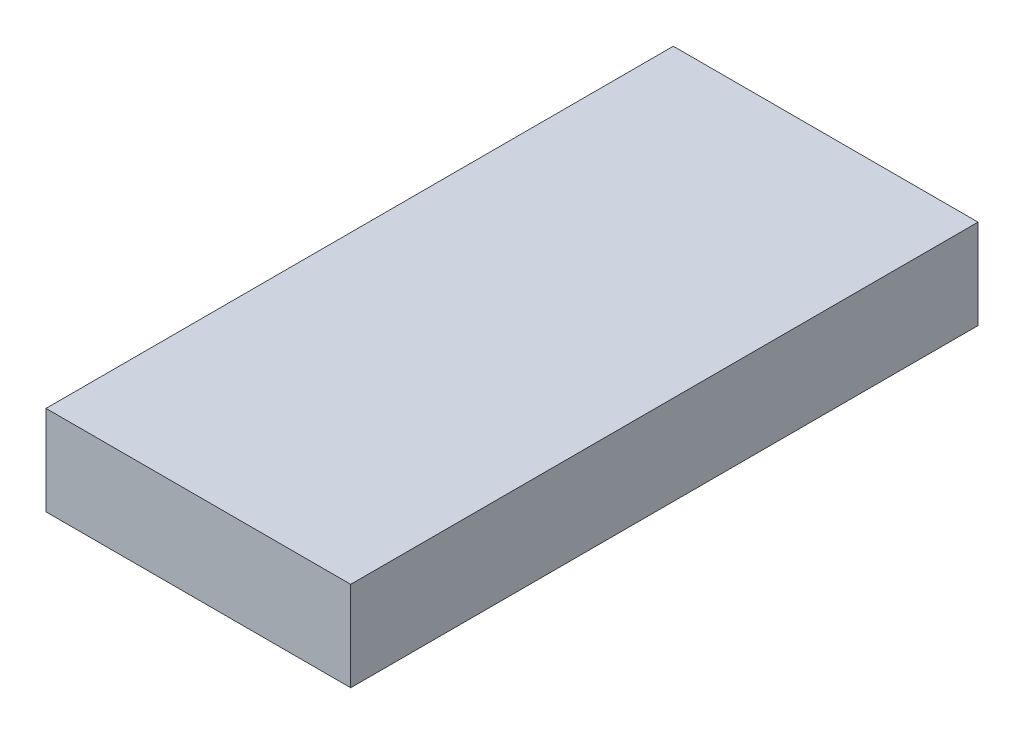
ISO-10303-21;
HEADER;
FILE_DESCRIPTION(('STEP AP214'),'2;1');
FILE_NAME('part.step','',(''),(''),'','','');
FILE_SCHEMA(('AUTOMOTIVE_DESIGN { 1 0 10303 214 1 1 1 1 }'));
ENDSEC;
DATA;
#1=APPLICATION_CONTEXT('core data for automotive mechanical design processes');
#2=APPLICATION_PROTOCOL_DEFINITION('international standard','automotive_design',2000,#1);
#3=PRODUCT_CONTEXT('',#1,'mechanical');
#4=PRODUCT('Part','Part','',(#3));
#5=PRODUCT_RELATED_PRODUCT_CATEGORY('part','',(#4));
#6=PRODUCT_DEFINITION_FORMATION('','',#4);
#7=PRODUCT_DEFINITION_CONTEXT('part definition',#1,'design');
#8=PRODUCT_DEFINITION('design','',#6,#7);
#9=PRODUCT_DEFINITION_SHAPE('','',#8);
#10=(LENGTH_UNIT() NAMED_UNIT(*) SI_UNIT(.MILLI.,.METRE.));
#11=(NAMED_UNIT(*) PLANE_ANGLE_UNIT() SI_UNIT($,.RADIAN.));
#12=(NAMED_UNIT(*) SI_UNIT($,.STERADIAN.) SOLID_ANGLE_UNIT());
#13=UNCERTAINTY_MEASURE_WITH_UNIT(LENGTH_MEASURE(1.E-05),#10,'distance_accuracy_value','');
#14=(GEOMETRIC_REPRESENTATION_CONTEXT(3) GLOBAL_UNCERTAINTY_ASSIGNED_CONTEXT((#13)) GLOBAL_UNIT_ASSIGNED_CONTEXT((#10,
#11,#12)) REPRESENTATION_CONTEXT('',''));
#15=CARTESIAN_POINT('',(0.,0.,0.));
#16=DIRECTION('',(0.,0.,1.));
#17=DIRECTION('',(1.,0.,0.));
#18=AXIS2_PLACEMENT_3D('',#15,#16,#17);
#19=CARTESIAN_POINT('',(8.5,5.,-17.5));
#20=DIRECTION('',(-1.,0.,0.));
#21=DIRECTION('',(0.,0.,1.));
#22=AXIS2_PLACEMENT_3D('',#19,#20,#21);
#23=PLANE('',#22);
#24=DIRECTION('',(0.,0.,-1.));
#25=VECTOR('',#24,1.);
#26=CARTESIAN_POINT('',(8.5,0.,-17.5));
#27=LINE('',#26,#25);
#28=CARTESIAN_POINT('',(8.5,0.,17.5));
#29=VERTEX_POINT('',#28);
#30=CARTESIAN_POINT('',(8.5,0.,-17.5));
#31=VERTEX_POINT('',#30);
#32=EDGE_CURVE('E96',#29,#31,#27,.T.);
#33=ORIENTED_EDGE('',*,*,#32,.T.);
#34=DIRECTION('',(0.,-1.,0.));
#35=VECTOR('',#34,1.);
#36=CARTESIAN_POINT('',(8.5,5.,-17.5));
#37=LINE('',#36,#35);
#38=CARTESIAN_POINT('',(8.5,5.,-17.5));
#39=VERTEX_POINT('',#38);
#40=EDGE_CURVE('E11',#39,#31,#37,.T.);
#41=ORIENTED_EDGE('',*,*,#40,.F.);
#42=DIRECTION('',(0.,0.,-1.));
#43=VECTOR('',#42,1.);
#44=CARTESIAN_POINT('',(8.5,5.,-17.5));
#45=LINE('',#44,#43);
#46=CARTESIAN_POINT('',(8.5,5.,17.5));
#47=VERTEX_POINT('',#46);
#48=EDGE_CURVE('E84',#47,#39,#45,.T.);
#49=ORIENTED_EDGE('',*,*,#48,.F.);
#50=DIRECTION('',(0.,-1.,0.));
#51=VECTOR('',#50,1.);
#52=CARTESIAN_POINT('',(8.5,5.,17.5));
#53=LINE('',#52,#51);
#54=EDGE_CURVE('E92',#47,#29,#53,.T.);
#55=ORIENTED_EDGE('',*,*,#54,.T.);
#56=EDGE_LOOP('',(#33,#41,#49,#55));
#57=FACE_BOUND('',#56,.T.);
#58=ADVANCED_FACE('F33',(#57),#23,.F.);
#59=CARTESIAN_POINT('',(-8.5,5.,-17.5));
#60=DIRECTION('',(0.,0.,1.));
#61=DIRECTION('',(1.,0.,0.));
#62=AXIS2_PLACEMENT_3D('',#59,#60,#61);
#63=PLANE('',#62);
#64=DIRECTION('',(-1.,0.,0.));
#65=VECTOR('',#64,1.);
#66=CARTESIAN_POINT('',(-8.5,0.,-17.5));
#67=LINE('',#66,#65);
#68=CARTESIAN_POINT('',(-8.5,0.,-17.5));
#69=VERTEX_POINT('',#68);
#70=EDGE_CURVE('E88',#31,#69,#67,.T.);
#71=ORIENTED_EDGE('',*,*,#70,.T.);
#72=DIRECTION('',(0.,-1.,0.));
#73=VECTOR('',#72,1.);
#74=CARTESIAN_POINT('',(-8.5,5.,-17.5));
#75=LINE('',#74,#73);
#76=CARTESIAN_POINT('',(-8.5,5.,-17.5));
#77=VERTEX_POINT('',#76);
#78=EDGE_CURVE('E41',#77,#69,#75,.T.);
#79=ORIENTED_EDGE('',*,*,#78,.F.);
#80=DIRECTION('',(-1.,0.,0.));
#81=VECTOR('',#80,1.);
#82=CARTESIAN_POINT('',(-8.5,5.,-17.5));
#83=LINE('',#82,#81);
#84=EDGE_CURVE('E79',#39,#77,#83,.T.);
#85=ORIENTED_EDGE('',*,*,#84,.F.);
#86=ORIENTED_EDGE('',*,*,#40,.T.);
#87=EDGE_LOOP('',(#71,#79,#85,#86));
#88=FACE_BOUND('',#87,.T.);
#89=ADVANCED_FACE('F87',(#88),#63,.F.);
#90=CARTESIAN_POINT('',(-8.5,5.,-17.5));
#91=DIRECTION('',(1.,0.,0.));
#92=DIRECTION('',(0.,0.,-1.));
#93=AXIS2_PLACEMENT_3D('',#90,#91,#92);
#94=PLANE('',#93);
#95=DIRECTION('',(0.,0.,1.));
#96=VECTOR('',#95,1.);
#97=CARTESIAN_POINT('',(-8.5,0.,-17.5));
#98=LINE('',#97,#96);
#99=CARTESIAN_POINT('',(-8.5,0.,17.5));
#100=VERTEX_POINT('',#99);
#101=EDGE_CURVE('E66',#69,#100,#98,.T.);
#102=ORIENTED_EDGE('',*,*,#101,.T.);
#103=DIRECTION('',(0.,-1.,0.));
#104=VECTOR('',#103,1.);
#105=CARTESIAN_POINT('',(-8.5,5.,17.5));
#106=LINE('',#105,#104);
#107=CARTESIAN_POINT('',(-8.5,5.,17.5));
#108=VERTEX_POINT('',#107);
#109=EDGE_CURVE('E89',#108,#100,#106,.T.);
#110=ORIENTED_EDGE('',*,*,#109,.F.);
#111=DIRECTION('',(0.,0.,1.));
#112=VECTOR('',#111,1.);
#113=CARTESIAN_POINT('',(-8.5,5.,-17.5));
#114=LINE('',#113,#112);
#115=EDGE_CURVE('E82',#77,#108,#114,.T.);
#116=ORIENTED_EDGE('',*,*,#115,.F.);
#117=ORIENTED_EDGE('',*,*,#78,.T.);
#118=EDGE_LOOP('',(#102,#110,#116,#117));
#119=FACE_BOUND('',#118,.T.);
#120=ADVANCED_FACE('F90',(#119),#94,.F.);
#121=CARTESIAN_POINT('',(-8.5,5.,17.5));
#122=DIRECTION('',(0.,0.,-1.));
#123=DIRECTION('',(-1.,0.,0.));
#124=AXIS2_PLACEMENT_3D('',#121,#122,#123);
#125=PLANE('',#124);
#126=DIRECTION('',(1.,0.,0.));
#127=VECTOR('',#126,1.);
#128=CARTESIAN_POINT('',(-8.5,0.,17.5));
#129=LINE('',#128,#127);
#130=EDGE_CURVE('E72',#100,#29,#129,.T.);
#131=ORIENTED_EDGE('',*,*,#130,.T.);
#132=ORIENTED_EDGE('',*,*,#54,.F.);
#133=DIRECTION('',(1.,0.,0.));
#134=VECTOR('',#133,1.);
#135=CARTESIAN_POINT('',(-8.5,5.,17.5));
#136=LINE('',#135,#134);
#137=EDGE_CURVE('E49',#108,#47,#136,.T.);
#138=ORIENTED_EDGE('',*,*,#137,.F.);
#139=ORIENTED_EDGE('',*,*,#109,.T.);
#140=EDGE_LOOP('',(#131,#132,#138,#139));
#141=FACE_BOUND('',#140,.T.);
#142=ADVANCED_FACE('F103',(#141),#125,.F.);
#143=CARTESIAN_POINT('',(0.,5.,0.));
#144=DIRECTION('',(0.,1.,0.));
#145=DIRECTION('',(0.,0.,1.));
#146=AXIS2_PLACEMENT_3D('',#143,#144,#145);
#147=PLANE('',#146);
#148=ORIENTED_EDGE('',*,*,#48,.T.);
#149=ORIENTED_EDGE('',*,*,#84,.T.);
#150=ORIENTED_EDGE('',*,*,#115,.T.);
#151=ORIENTED_EDGE('',*,*,#137,.T.);
#152=EDGE_LOOP('',(#148,#149,#150,#151));
#153=FACE_BOUND('',#152,.T.);
#154=ADVANCED_FACE('F80',(#153),#147,.T.);
#155=CARTESIAN_POINT('',(0.,0.,0.));
#156=DIRECTION('',(0.,1.,0.));
#157=DIRECTION('',(0.,0.,1.));
#158=AXIS2_PLACEMENT_3D('',#155,#156,#157);
#159=PLANE('',#158);
#160=ORIENTED_EDGE('',*,*,#32,.F.);
#161=ORIENTED_EDGE('',*,*,#130,.F.);
#162=ORIENTED_EDGE('',*,*,#101,.F.);
#163=ORIENTED_EDGE('',*,*,#70,.F.);
#164=EDGE_LOOP('',(#160,#161,#162,#163));
#165=FACE_BOUND('',#164,.T.);
#166=ADVANCED_FACE('F106',(#165),#159,.F.);
#167=CLOSED_SHELL('',(#58,#89,#120,#142,#154,#166));
#168=MANIFOLD_SOLID_BREP('B2',#167);
#169=ADVANCED_BREP_SHAPE_REPRESENTATION('',(#18,#168),#14);
#170=SHAPE_DEFINITION_REPRESENTATION(#9,#169);
ENDSEC;
END-ISO-10303-21;
